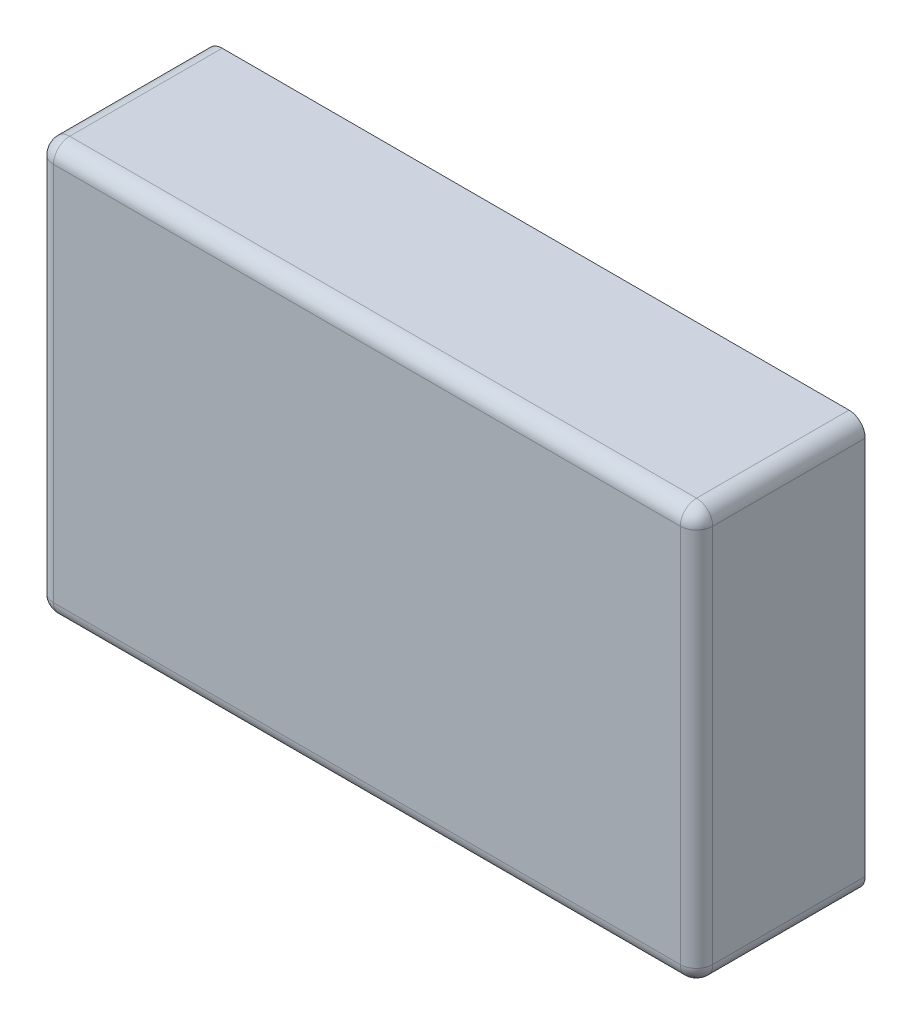
ISO-10303-21;
HEADER;
FILE_DESCRIPTION(('STEP AP214'),'2;1');
FILE_NAME('part.step','',(''),(''),'','','');
FILE_SCHEMA(('AUTOMOTIVE_DESIGN { 1 0 10303 214 1 1 1 1 }'));
ENDSEC;
DATA;
#1=APPLICATION_CONTEXT('core data for automotive mechanical design processes');
#2=APPLICATION_PROTOCOL_DEFINITION('international standard','automotive_design',2000,#1);
#3=PRODUCT_CONTEXT('',#1,'mechanical');
#4=PRODUCT('Part','Part','',(#3));
#5=PRODUCT_RELATED_PRODUCT_CATEGORY('part','',(#4));
#6=PRODUCT_DEFINITION_FORMATION('','',#4);
#7=PRODUCT_DEFINITION_CONTEXT('part definition',#1,'design');
#8=PRODUCT_DEFINITION('design','',#6,#7);
#9=PRODUCT_DEFINITION_SHAPE('','',#8);
#10=(LENGTH_UNIT() NAMED_UNIT(*) SI_UNIT(.MILLI.,.METRE.));
#11=(NAMED_UNIT(*) PLANE_ANGLE_UNIT() SI_UNIT($,.RADIAN.));
#12=(NAMED_UNIT(*) SI_UNIT($,.STERADIAN.) SOLID_ANGLE_UNIT());
#13=UNCERTAINTY_MEASURE_WITH_UNIT(LENGTH_MEASURE(1.E-05),#10,'distance_accuracy_value','');
#14=(GEOMETRIC_REPRESENTATION_CONTEXT(3) GLOBAL_UNCERTAINTY_ASSIGNED_CONTEXT((#13)) GLOBAL_UNIT_ASSIGNED_CONTEXT((#10,
#11,#12)) REPRESENTATION_CONTEXT('',''));
#15=CARTESIAN_POINT('',(0.,0.,0.));
#16=DIRECTION('',(0.,0.,1.));
#17=DIRECTION('',(1.,0.,0.));
#18=AXIS2_PLACEMENT_3D('',#15,#16,#17);
#19=CARTESIAN_POINT('',(16.631,26.15,10.9));
#20=CARTESIAN_POINT('',(16.631,26.15,10.9));
#21=CARTESIAN_POINT('',(16.631,26.15,10.9));
#22=CARTESIAN_POINT('',(16.631,26.15,10.9));
#23=CARTESIAN_POINT('',(16.631,26.15,11.4857864376269));
#24=CARTESIAN_POINT('',(16.631,26.4931457505076,11.4857864376269));
#25=CARTESIAN_POINT('',(16.631,26.7357864376269,11.2431457505076));
#26=CARTESIAN_POINT('',(16.631,26.7357864376269,10.9));
#27=CARTESIAN_POINT('',(17.0452135623731,26.15,11.9));
#28=CARTESIAN_POINT('',(17.0452135623731,26.7357864376269,11.9));
#29=CARTESIAN_POINT('',(17.0452135623731,27.15,11.4857864376269));
#30=CARTESIAN_POINT('',(17.0452135623731,27.15,10.9));
#31=CARTESIAN_POINT('',(17.631,26.15,11.9));
#32=CARTESIAN_POINT('',(17.631,26.7357864376269,11.9));
#33=CARTESIAN_POINT('',(17.631,27.15,11.4857864376269));
#34=CARTESIAN_POINT('',(17.631,27.15,10.9));
#35=(BOUNDED_SURFACE() B_SPLINE_SURFACE(3,3,((#19,#20,#21,#22),(#23,#24,#25,#26),(#27,#28,#29,
#30),(#31,#32,#33,#34)),.UNSPECIFIED.,.F.,.F.,.F.) B_SPLINE_SURFACE_WITH_KNOTS((4,4),(4,4),(0.,
1.),(0.,1.),.UNSPECIFIED.) GEOMETRIC_REPRESENTATION_ITEM() RATIONAL_B_SPLINE_SURFACE(((1.,
0.804737854124365,0.804737854124365,1.),(0.804737854124365,0.647603013860688,0.647603013860688,
0.804737854124365),(0.804737854124365,0.647603013860688,0.647603013860688,0.804737854124365),
(1.,0.804737854124365,0.804737854124365,1.))) REPRESENTATION_ITEM('') SURFACE());
#36=CARTESIAN_POINT('',(17.631,26.15,10.9));
#37=DIRECTION('',(1.,0.,0.));
#38=DIRECTION('',(0.,-1.,0.));
#39=AXIS2_PLACEMENT_3D('',#36,#37,#38);
#40=CIRCLE('',#39,1.);
#41=CARTESIAN_POINT('',(17.631,27.15,10.9));
#42=VERTEX_POINT('',#41);
#43=CARTESIAN_POINT('',(17.631,26.15,11.9));
#44=VERTEX_POINT('',#43);
#45=EDGE_CURVE('E206',#42,#44,#40,.T.);
#46=CARTESIAN_POINT('',(17.631,26.15,10.9));
#47=DIRECTION('',(0.,0.,-1.));
#48=DIRECTION('',(1.,0.,0.));
#49=AXIS2_PLACEMENT_3D('',#46,#47,#48);
#50=CIRCLE('',#49,1.);
#51=CARTESIAN_POINT('',(16.631,26.15,10.9));
#52=VERTEX_POINT('',#51);
#53=EDGE_CURVE('E204',#52,#42,#50,.T.);
#54=CARTESIAN_POINT('',(17.631,26.15,10.9));
#55=DIRECTION('',(0.,-1.,0.));
#56=DIRECTION('',(0.,0.,-1.));
#57=AXIS2_PLACEMENT_3D('',#54,#55,#56);
#58=CIRCLE('',#57,1.);
#59=EDGE_CURVE('E192',#44,#52,#58,.T.);
#60=ORIENTED_EDGE('',*,*,#45,.F.);
#61=ORIENTED_EDGE('',*,*,#53,.F.);
#62=ORIENTED_EDGE('',*,*,#59,.F.);
#63=EDGE_LOOP('',(#60,#61,#62));
#64=FACE_BOUND('',#63,.T.);
#65=ADVANCED_FACE('F18',(#64),#35,.T.);
#66=CARTESIAN_POINT('',(56.271,26.15,11.9));
#67=CARTESIAN_POINT('',(56.271,26.7357864376269,11.9));
#68=CARTESIAN_POINT('',(56.271,27.15,11.4857864376269));
#69=CARTESIAN_POINT('',(56.271,27.15,10.9));
#70=CARTESIAN_POINT('',(56.8567864376269,26.15,11.9));
#71=CARTESIAN_POINT('',(56.8567864376269,26.7357864376269,11.9));
#72=CARTESIAN_POINT('',(56.8567864376269,27.15,11.4857864376269));
#73=CARTESIAN_POINT('',(56.8567864376269,27.15,10.9));
#74=CARTESIAN_POINT('',(57.271,26.15,11.4857864376269));
#75=CARTESIAN_POINT('',(57.271,26.4931457505076,11.4857864376269));
#76=CARTESIAN_POINT('',(57.271,26.7357864376269,11.2431457505076));
#77=CARTESIAN_POINT('',(57.271,26.7357864376269,10.9));
#78=CARTESIAN_POINT('',(57.271,26.15,10.9));
#79=CARTESIAN_POINT('',(57.2710000000001,26.15,10.9));
#80=CARTESIAN_POINT('',(57.2710000000001,26.15,10.9));
#81=CARTESIAN_POINT('',(57.271,26.15,10.9));
#82=(BOUNDED_SURFACE() B_SPLINE_SURFACE(3,3,((#66,#67,#68,#69),(#70,#71,#72,#73),(#74,#75,#76,
#77),(#78,#79,#80,#81)),.UNSPECIFIED.,.F.,.F.,.F.) B_SPLINE_SURFACE_WITH_KNOTS((4,4),(4,4),(0.,
1.),(0.,1.),.UNSPECIFIED.) GEOMETRIC_REPRESENTATION_ITEM() RATIONAL_B_SPLINE_SURFACE(((1.,
0.804737854124364,0.804737854124364,1.),(0.804737854124365,0.647603013860688,0.647603013860688,
0.804737854124365),(0.804737854124365,0.647603013860688,0.647603013860688,0.804737854124365),
(1.,0.804737854124364,0.804737854124364,1.))) REPRESENTATION_ITEM('') SURFACE());
#83=CARTESIAN_POINT('',(56.271,26.15,10.9));
#84=DIRECTION('',(0.,0.,-1.));
#85=DIRECTION('',(1.,0.,0.));
#86=AXIS2_PLACEMENT_3D('',#83,#84,#85);
#87=CIRCLE('',#86,1.);
#88=CARTESIAN_POINT('',(56.271,27.15,10.9));
#89=VERTEX_POINT('',#88);
#90=CARTESIAN_POINT('',(57.271,26.15,10.9));
#91=VERTEX_POINT('',#90);
#92=EDGE_CURVE('E240',#89,#91,#87,.T.);
#93=CARTESIAN_POINT('',(56.271,26.15,10.9));
#94=DIRECTION('',(-1.,0.,0.));
#95=DIRECTION('',(0.,-1.,0.));
#96=AXIS2_PLACEMENT_3D('',#93,#94,#95);
#97=CIRCLE('',#96,1.);
#98=CARTESIAN_POINT('',(56.271,26.15,11.9));
#99=VERTEX_POINT('',#98);
#100=EDGE_CURVE('E201',#99,#89,#97,.T.);
#101=CARTESIAN_POINT('',(56.271,26.15,10.9));
#102=DIRECTION('',(0.,-1.,0.));
#103=DIRECTION('',(-1.,0.,0.));
#104=AXIS2_PLACEMENT_3D('',#101,#102,#103);
#105=CIRCLE('',#104,1.);
#106=EDGE_CURVE('E244',#91,#99,#105,.T.);
#107=ORIENTED_EDGE('',*,*,#92,.F.);
#108=ORIENTED_EDGE('',*,*,#100,.F.);
#109=ORIENTED_EDGE('',*,*,#106,.F.);
#110=EDGE_LOOP('',(#107,#108,#109));
#111=FACE_BOUND('',#110,.T.);
#112=ADVANCED_FACE('F408',(#111),#82,.T.);
#113=CARTESIAN_POINT('',(56.271,1.75,10.9));
#114=CARTESIAN_POINT('',(56.271,1.75000000000001,11.4857864376269));
#115=CARTESIAN_POINT('',(56.271,2.16421356237311,11.9));
#116=CARTESIAN_POINT('',(56.271,2.75,11.9));
#117=CARTESIAN_POINT('',(56.8567864376269,1.75000000000001,10.9));
#118=CARTESIAN_POINT('',(56.8567864376269,1.75000000000001,11.4857864376269));
#119=CARTESIAN_POINT('',(56.8567864376269,2.16421356237311,11.9));
#120=CARTESIAN_POINT('',(56.8567864376269,2.75000000000001,11.9));
#121=CARTESIAN_POINT('',(57.271,2.16421356237311,10.9));
#122=CARTESIAN_POINT('',(57.271,2.1642135623731,11.2431457505076));
#123=CARTESIAN_POINT('',(57.271,2.40685424949239,11.4857864376269));
#124=CARTESIAN_POINT('',(57.271,2.75000000000001,11.4857864376269));
#125=CARTESIAN_POINT('',(57.271,2.75,10.9));
#126=CARTESIAN_POINT('',(57.271,2.75000000000001,10.9));
#127=CARTESIAN_POINT('',(57.271,2.75000000000001,10.9));
#128=CARTESIAN_POINT('',(57.271,2.75,10.9));
#129=(BOUNDED_SURFACE() B_SPLINE_SURFACE(3,3,((#113,#114,#115,#116),(#117,#118,#119,#120),(#121,
#122,#123,#124),(#125,#126,#127,#128)),.UNSPECIFIED.,.F.,.F.,
.F.) B_SPLINE_SURFACE_WITH_KNOTS((4,4),(4,4),(0.,1.),(0.,1.),
.UNSPECIFIED.) GEOMETRIC_REPRESENTATION_ITEM() RATIONAL_B_SPLINE_SURFACE(((1.,0.804737854124365,
0.804737854124365,1.),(0.804737854124365,0.647603013860688,0.647603013860688,0.804737854124365),
(0.804737854124365,0.647603013860688,0.647603013860688,0.804737854124365),(1.,0.804737854124365,
0.804737854124365,1.))) REPRESENTATION_ITEM('') SURFACE());
#130=CARTESIAN_POINT('',(56.271,2.75,10.9));
#131=DIRECTION('',(0.,0.,-1.));
#132=DIRECTION('',(1.,0.,0.));
#133=AXIS2_PLACEMENT_3D('',#130,#131,#132);
#134=CIRCLE('',#133,1.);
#135=CARTESIAN_POINT('',(57.271,2.75,10.9));
#136=VERTEX_POINT('',#135);
#137=CARTESIAN_POINT('',(56.271,1.75,10.9));
#138=VERTEX_POINT('',#137);
#139=EDGE_CURVE('E245',#136,#138,#134,.T.);
#140=CARTESIAN_POINT('',(56.271,2.75,10.9));
#141=DIRECTION('',(0.,1.,0.));
#142=DIRECTION('',(-1.,0.,0.));
#143=AXIS2_PLACEMENT_3D('',#140,#141,#142);
#144=CIRCLE('',#143,1.);
#145=CARTESIAN_POINT('',(56.271,2.75,11.9));
#146=VERTEX_POINT('',#145);
#147=EDGE_CURVE('E211',#146,#136,#144,.T.);
#148=CARTESIAN_POINT('',(56.271,2.75,10.9));
#149=DIRECTION('',(-1.,0.,0.));
#150=DIRECTION('',(0.,0.,1.));
#151=AXIS2_PLACEMENT_3D('',#148,#149,#150);
#152=CIRCLE('',#151,1.);
#153=EDGE_CURVE('E322',#138,#146,#152,.T.);
#154=ORIENTED_EDGE('',*,*,#139,.F.);
#155=ORIENTED_EDGE('',*,*,#147,.F.);
#156=ORIENTED_EDGE('',*,*,#153,.F.);
#157=EDGE_LOOP('',(#154,#155,#156));
#158=FACE_BOUND('',#157,.T.);
#159=ADVANCED_FACE('F414',(#158),#129,.T.);
#160=CARTESIAN_POINT('',(57.271,1.75,11.9));
#161=DIRECTION('',(0.,0.,-1.));
#162=DIRECTION('',(-1.,0.,0.));
#163=AXIS2_PLACEMENT_3D('',#160,#161,#162);
#164=PLANE('',#163);
#165=DIRECTION('',(0.,1.,0.));
#166=VECTOR('',#165,1.);
#167=CARTESIAN_POINT('',(17.631,1.75,11.9));
#168=LINE('',#167,#166);
#169=CARTESIAN_POINT('',(17.631,2.75,11.9));
#170=VERTEX_POINT('',#169);
#171=EDGE_CURVE('E11',#170,#44,#168,.T.);
#172=ORIENTED_EDGE('',*,*,#171,.F.);
#173=DIRECTION('',(-1.,0.,0.));
#174=VECTOR('',#173,1.);
#175=CARTESIAN_POINT('',(57.271,2.75,11.9));
#176=LINE('',#175,#174);
#177=EDGE_CURVE('E317',#146,#170,#176,.T.);
#178=ORIENTED_EDGE('',*,*,#177,.F.);
#179=DIRECTION('',(0.,-1.,0.));
#180=VECTOR('',#179,1.);
#181=CARTESIAN_POINT('',(56.271,27.15,11.9));
#182=LINE('',#181,#180);
#183=EDGE_CURVE('E270',#99,#146,#182,.T.);
#184=ORIENTED_EDGE('',*,*,#183,.F.);
#185=DIRECTION('',(1.,0.,0.));
#186=VECTOR('',#185,1.);
#187=CARTESIAN_POINT('',(16.631,26.15,11.9));
#188=LINE('',#187,#186);
#189=EDGE_CURVE('E273',#44,#99,#188,.T.);
#190=ORIENTED_EDGE('',*,*,#189,.F.);
#191=EDGE_LOOP('',(#172,#178,#184,#190));
#192=FACE_BOUND('',#191,.T.);
#193=ADVANCED_FACE('F453',(#192),#164,.F.);
#194=CARTESIAN_POINT('',(16.631,2.75,10.9));
#195=CARTESIAN_POINT('',(16.631,2.75000000000001,10.9));
#196=CARTESIAN_POINT('',(16.631,2.75000000000001,10.9));
#197=CARTESIAN_POINT('',(16.631,2.75,10.9));
#198=CARTESIAN_POINT('',(16.631,2.1642135623731,10.9));
#199=CARTESIAN_POINT('',(16.631,2.1642135623731,11.2431457505076));
#200=CARTESIAN_POINT('',(16.631,2.40685424949239,11.4857864376269));
#201=CARTESIAN_POINT('',(16.631,2.75000000000001,11.4857864376269));
#202=CARTESIAN_POINT('',(17.0452135623731,1.75000000000001,10.9));
#203=CARTESIAN_POINT('',(17.0452135623731,1.75000000000001,11.4857864376269));
#204=CARTESIAN_POINT('',(17.0452135623731,2.1642135623731,11.9));
#205=CARTESIAN_POINT('',(17.0452135623731,2.75000000000001,11.9));
#206=CARTESIAN_POINT('',(17.631,1.75,10.9));
#207=CARTESIAN_POINT('',(17.631,1.75000000000001,11.4857864376269));
#208=CARTESIAN_POINT('',(17.631,2.1642135623731,11.9));
#209=CARTESIAN_POINT('',(17.631,2.75,11.9));
#210=(BOUNDED_SURFACE() B_SPLINE_SURFACE(3,3,((#194,#195,#196,#197),(#198,#199,#200,#201),(#202,
#203,#204,#205),(#206,#207,#208,#209)),.UNSPECIFIED.,.F.,.F.,
.F.) B_SPLINE_SURFACE_WITH_KNOTS((4,4),(4,4),(0.,1.),(0.,1.),
.UNSPECIFIED.) GEOMETRIC_REPRESENTATION_ITEM() RATIONAL_B_SPLINE_SURFACE(((1.,0.804737854124365,
0.804737854124365,1.),(0.804737854124365,0.647603013860688,0.647603013860688,0.804737854124365),
(0.804737854124365,0.647603013860688,0.647603013860688,0.804737854124365),(1.,0.804737854124365,
0.804737854124365,1.))) REPRESENTATION_ITEM('') SURFACE());
#211=CARTESIAN_POINT('',(17.631,2.75,10.9));
#212=DIRECTION('',(1.,0.,0.));
#213=DIRECTION('',(0.,0.,1.));
#214=AXIS2_PLACEMENT_3D('',#211,#212,#213);
#215=CIRCLE('',#214,1.);
#216=CARTESIAN_POINT('',(17.631,1.75,10.9));
#217=VERTEX_POINT('',#216);
#218=EDGE_CURVE('E220',#170,#217,#215,.T.);
#219=CARTESIAN_POINT('',(17.631,2.75,10.9));
#220=DIRECTION('',(0.,1.,0.));
#221=DIRECTION('',(0.,0.,-1.));
#222=AXIS2_PLACEMENT_3D('',#219,#220,#221);
#223=CIRCLE('',#222,1.);
#224=CARTESIAN_POINT('',(16.631,2.75,10.9));
#225=VERTEX_POINT('',#224);
#226=EDGE_CURVE('E29',#225,#170,#223,.T.);
#227=CARTESIAN_POINT('',(17.631,2.75,10.9));
#228=DIRECTION('',(0.,0.,-1.));
#229=DIRECTION('',(1.,0.,0.));
#230=AXIS2_PLACEMENT_3D('',#227,#228,#229);
#231=CIRCLE('',#230,1.);
#232=EDGE_CURVE('E321',#217,#225,#231,.T.);
#233=ORIENTED_EDGE('',*,*,#218,.F.);
#234=ORIENTED_EDGE('',*,*,#226,.F.);
#235=ORIENTED_EDGE('',*,*,#232,.F.);
#236=EDGE_LOOP('',(#233,#234,#235));
#237=FACE_BOUND('',#236,.T.);
#238=ADVANCED_FACE('F448',(#237),#210,.T.);
#239=CARTESIAN_POINT('',(26.791,24.61,-0.500000000000007));
#240=DIRECTION('',(0.,0.,1.));
#241=DIRECTION('',(0.,-1.,0.));
#242=AXIS2_PLACEMENT_3D('',#239,#240,#241);
#243=PLANE('',#242);
#244=CARTESIAN_POINT('',(26.791,24.61,-0.500000000000007));
#245=DIRECTION('',(0.,0.,1.));
#246=DIRECTION('',(1.,0.,0.));
#247=AXIS2_PLACEMENT_3D('',#244,#245,#246);
#248=CIRCLE('',#247,0.5);
#249=CARTESIAN_POINT('',(26.291,24.61,-0.500000000000007));
#250=VERTEX_POINT('',#249);
#251=EDGE_CURVE('E295',#250,#250,#248,.T.);
#252=ORIENTED_EDGE('',*,*,#251,.F.);
#253=EDGE_LOOP('',(#252));
#254=FACE_BOUND('',#253,.T.);
#255=ADVANCED_FACE('F402',(#254),#243,.F.);
#256=CARTESIAN_POINT('',(26.791,16.99,-0.500000000000007));
#257=DIRECTION('',(0.,0.,1.));
#258=DIRECTION('',(0.,-1.,0.));
#259=AXIS2_PLACEMENT_3D('',#256,#257,#258);
#260=PLANE('',#259);
#261=CARTESIAN_POINT('',(26.791,16.99,-0.500000000000007));
#262=DIRECTION('',(0.,0.,1.));
#263=DIRECTION('',(1.,0.,0.));
#264=AXIS2_PLACEMENT_3D('',#261,#262,#263);
#265=CIRCLE('',#264,0.5);
#266=CARTESIAN_POINT('',(26.291,16.99,-0.500000000000007));
#267=VERTEX_POINT('',#266);
#268=EDGE_CURVE('E296',#267,#267,#265,.T.);
#269=ORIENTED_EDGE('',*,*,#268,.F.);
#270=EDGE_LOOP('',(#269));
#271=FACE_BOUND('',#270,.T.);
#272=ADVANCED_FACE('F392',(#271),#260,.F.);
#273=CARTESIAN_POINT('',(26.791,11.91,-0.500000000000007));
#274=DIRECTION('',(0.,0.,1.));
#275=DIRECTION('',(0.,-1.,0.));
#276=AXIS2_PLACEMENT_3D('',#273,#274,#275);
#277=PLANE('',#276);
#278=CARTESIAN_POINT('',(26.791,11.91,-0.500000000000007));
#279=DIRECTION('',(0.,0.,1.));
#280=DIRECTION('',(1.,0.,0.));
#281=AXIS2_PLACEMENT_3D('',#278,#279,#280);
#282=CIRCLE('',#281,0.5);
#283=CARTESIAN_POINT('',(26.291,11.91,-0.500000000000007));
#284=VERTEX_POINT('',#283);
#285=EDGE_CURVE('E259',#284,#284,#282,.T.);
#286=ORIENTED_EDGE('',*,*,#285,.F.);
#287=EDGE_LOOP('',(#286));
#288=FACE_BOUND('',#287,.T.);
#289=ADVANCED_FACE('F389',(#288),#277,.F.);
#290=CARTESIAN_POINT('',(47.111,24.61,-0.5));
#291=DIRECTION('',(0.,0.,1.));
#292=DIRECTION('',(0.,-1.,0.));
#293=AXIS2_PLACEMENT_3D('',#290,#291,#292);
#294=PLANE('',#293);
#295=CARTESIAN_POINT('',(47.111,24.61,-0.5));
#296=DIRECTION('',(0.,0.,1.));
#297=DIRECTION('',(1.,0.,0.));
#298=AXIS2_PLACEMENT_3D('',#295,#296,#297);
#299=CIRCLE('',#298,0.5);
#300=CARTESIAN_POINT('',(46.611,24.61,-0.5));
#301=VERTEX_POINT('',#300);
#302=EDGE_CURVE('E341',#301,#301,#299,.T.);
#303=ORIENTED_EDGE('',*,*,#302,.F.);
#304=EDGE_LOOP('',(#303));
#305=FACE_BOUND('',#304,.T.);
#306=ADVANCED_FACE('F391',(#305),#294,.F.);
#307=CARTESIAN_POINT('',(47.111,14.45,-0.5));
#308=DIRECTION('',(0.,0.,1.));
#309=DIRECTION('',(0.,-1.,0.));
#310=AXIS2_PLACEMENT_3D('',#307,#308,#309);
#311=PLANE('',#310);
#312=CARTESIAN_POINT('',(47.111,14.45,-0.5));
#313=DIRECTION('',(0.,0.,1.));
#314=DIRECTION('',(1.,0.,0.));
#315=AXIS2_PLACEMENT_3D('',#312,#313,#314);
#316=CIRCLE('',#315,0.5);
#317=CARTESIAN_POINT('',(46.611,14.45,-0.5));
#318=VERTEX_POINT('',#317);
#319=EDGE_CURVE('E144',#318,#318,#316,.T.);
#320=ORIENTED_EDGE('',*,*,#319,.F.);
#321=EDGE_LOOP('',(#320));
#322=FACE_BOUND('',#321,.T.);
#323=ADVANCED_FACE('F399',(#322),#311,.F.);
#324=CARTESIAN_POINT('',(47.111,4.29,-0.5));
#325=DIRECTION('',(0.,0.,1.));
#326=DIRECTION('',(0.,-1.,0.));
#327=AXIS2_PLACEMENT_3D('',#324,#325,#326);
#328=PLANE('',#327);
#329=CARTESIAN_POINT('',(47.111,4.29,-0.5));
#330=DIRECTION('',(0.,0.,1.));
#331=DIRECTION('',(1.,0.,0.));
#332=AXIS2_PLACEMENT_3D('',#329,#330,#331);
#333=CIRCLE('',#332,0.5);
#334=CARTESIAN_POINT('',(46.611,4.29,-0.5));
#335=VERTEX_POINT('',#334);
#336=EDGE_CURVE('E303',#335,#335,#333,.T.);
#337=ORIENTED_EDGE('',*,*,#336,.F.);
#338=EDGE_LOOP('',(#337));
#339=FACE_BOUND('',#338,.T.);
#340=ADVANCED_FACE('F522',(#339),#328,.F.);
#341=CARTESIAN_POINT('',(17.631,1.75,10.9));
#342=DIRECTION('',(0.,1.,0.));
#343=DIRECTION('',(0.,0.,-1.));
#344=AXIS2_PLACEMENT_3D('',#341,#342,#343);
#345=CYLINDRICAL_SURFACE('',#344,1.);
#346=ORIENTED_EDGE('',*,*,#59,.T.);
#347=DIRECTION('',(0.,-1.,0.));
#348=VECTOR('',#347,1.);
#349=CARTESIAN_POINT('',(16.631,1.75,10.9));
#350=LINE('',#349,#348);
#351=EDGE_CURVE('E196',#52,#225,#350,.T.);
#352=ORIENTED_EDGE('',*,*,#351,.T.);
#353=ORIENTED_EDGE('',*,*,#226,.T.);
#354=ORIENTED_EDGE('',*,*,#171,.T.);
#355=EDGE_LOOP('',(#346,#352,#353,#354));
#356=FACE_BOUND('',#355,.T.);
#357=ADVANCED_FACE('F194',(#356),#345,.T.);
#358=CARTESIAN_POINT('',(16.631,26.15,10.9));
#359=DIRECTION('',(1.,0.,0.));
#360=DIRECTION('',(0.,-1.,0.));
#361=AXIS2_PLACEMENT_3D('',#358,#359,#360);
#362=CYLINDRICAL_SURFACE('',#361,1.);
#363=ORIENTED_EDGE('',*,*,#45,.T.);
#364=ORIENTED_EDGE('',*,*,#189,.T.);
#365=ORIENTED_EDGE('',*,*,#100,.T.);
#366=DIRECTION('',(-1.,0.,0.));
#367=VECTOR('',#366,1.);
#368=CARTESIAN_POINT('',(16.631,27.15,10.9));
#369=LINE('',#368,#367);
#370=EDGE_CURVE('E234',#89,#42,#369,.T.);
#371=ORIENTED_EDGE('',*,*,#370,.T.);
#372=EDGE_LOOP('',(#363,#364,#365,#371));
#373=FACE_BOUND('',#372,.T.);
#374=ADVANCED_FACE('F521',(#373),#362,.T.);
#375=CARTESIAN_POINT('',(17.631,26.15,1.5));
#376=DIRECTION('',(0.,0.,1.));
#377=DIRECTION('',(1.,0.,0.));
#378=AXIS2_PLACEMENT_3D('',#375,#376,#377);
#379=CYLINDRICAL_SURFACE('',#378,1.);
#380=ORIENTED_EDGE('',*,*,#53,.T.);
#381=DIRECTION('',(0.,0.,-1.));
#382=VECTOR('',#381,1.);
#383=CARTESIAN_POINT('',(17.631,27.15,1.5));
#384=LINE('',#383,#382);
#385=CARTESIAN_POINT('',(17.631,27.15,1.5));
#386=VERTEX_POINT('',#385);
#387=EDGE_CURVE('E336',#42,#386,#384,.T.);
#388=ORIENTED_EDGE('',*,*,#387,.T.);
#389=CARTESIAN_POINT('',(17.631,26.15,1.5));
#390=DIRECTION('',(0.,0.,1.));
#391=DIRECTION('',(1.,0.,0.));
#392=AXIS2_PLACEMENT_3D('',#389,#390,#391);
#393=CIRCLE('',#392,1.);
#394=CARTESIAN_POINT('',(16.631,26.15,1.5));
#395=VERTEX_POINT('',#394);
#396=EDGE_CURVE('E223',#386,#395,#393,.T.);
#397=ORIENTED_EDGE('',*,*,#396,.T.);
#398=DIRECTION('',(0.,0.,1.));
#399=VECTOR('',#398,1.);
#400=CARTESIAN_POINT('',(16.631,26.15,1.5));
#401=LINE('',#400,#399);
#402=EDGE_CURVE('E216',#395,#52,#401,.T.);
#403=ORIENTED_EDGE('',*,*,#402,.T.);
#404=EDGE_LOOP('',(#380,#388,#397,#403));
#405=FACE_BOUND('',#404,.T.);
#406=ADVANCED_FACE('F221',(#405),#379,.T.);
#407=CARTESIAN_POINT('',(56.271,27.15,10.9));
#408=DIRECTION('',(0.,-1.,0.));
#409=DIRECTION('',(-1.,0.,0.));
#410=AXIS2_PLACEMENT_3D('',#407,#408,#409);
#411=CYLINDRICAL_SURFACE('',#410,1.);
#412=ORIENTED_EDGE('',*,*,#106,.T.);
#413=ORIENTED_EDGE('',*,*,#183,.T.);
#414=ORIENTED_EDGE('',*,*,#147,.T.);
#415=DIRECTION('',(0.,1.,0.));
#416=VECTOR('',#415,1.);
#417=CARTESIAN_POINT('',(57.271,27.15,10.9));
#418=LINE('',#417,#416);
#419=EDGE_CURVE('E309',#136,#91,#418,.T.);
#420=ORIENTED_EDGE('',*,*,#419,.T.);
#421=EDGE_LOOP('',(#412,#413,#414,#420));
#422=FACE_BOUND('',#421,.T.);
#423=ADVANCED_FACE('F561',(#422),#411,.T.);
#424=CARTESIAN_POINT('',(56.271,26.15,1.5));
#425=DIRECTION('',(0.,0.,1.));
#426=DIRECTION('',(1.,0.,0.));
#427=AXIS2_PLACEMENT_3D('',#424,#425,#426);
#428=CYLINDRICAL_SURFACE('',#427,1.);
#429=ORIENTED_EDGE('',*,*,#92,.T.);
#430=DIRECTION('',(0.,0.,-1.));
#431=VECTOR('',#430,1.);
#432=CARTESIAN_POINT('',(57.271,26.15,1.5));
#433=LINE('',#432,#431);
#434=CARTESIAN_POINT('',(57.271,26.15,1.5));
#435=VERTEX_POINT('',#434);
#436=EDGE_CURVE('E277',#91,#435,#433,.T.);
#437=ORIENTED_EDGE('',*,*,#436,.T.);
#438=CARTESIAN_POINT('',(56.271,26.15,1.5));
#439=DIRECTION('',(0.,0.,1.));
#440=DIRECTION('',(1.,0.,0.));
#441=AXIS2_PLACEMENT_3D('',#438,#439,#440);
#442=CIRCLE('',#441,1.);
#443=CARTESIAN_POINT('',(56.271,27.15,1.5));
#444=VERTEX_POINT('',#443);
#445=EDGE_CURVE('E255',#435,#444,#442,.T.);
#446=ORIENTED_EDGE('',*,*,#445,.T.);
#447=DIRECTION('',(0.,0.,1.));
#448=VECTOR('',#447,1.);
#449=CARTESIAN_POINT('',(56.271,27.15,1.5));
#450=LINE('',#449,#448);
#451=EDGE_CURVE('E226',#444,#89,#450,.T.);
#452=ORIENTED_EDGE('',*,*,#451,.T.);
#453=EDGE_LOOP('',(#429,#437,#446,#452));
#454=FACE_BOUND('',#453,.T.);
#455=ADVANCED_FACE('F563',(#454),#428,.T.);
#456=CARTESIAN_POINT('',(56.271,2.75,1.5));
#457=DIRECTION('',(0.,0.,1.));
#458=DIRECTION('',(1.,0.,0.));
#459=AXIS2_PLACEMENT_3D('',#456,#457,#458);
#460=CYLINDRICAL_SURFACE('',#459,1.);
#461=CARTESIAN_POINT('',(56.271,2.75,1.5));
#462=DIRECTION('',(0.,0.,1.));
#463=DIRECTION('',(1.,0.,0.));
#464=AXIS2_PLACEMENT_3D('',#461,#462,#463);
#465=CIRCLE('',#464,1.);
#466=CARTESIAN_POINT('',(56.271,1.75,1.5));
#467=VERTEX_POINT('',#466);
#468=CARTESIAN_POINT('',(57.271,2.75,1.5));
#469=VERTEX_POINT('',#468);
#470=EDGE_CURVE('E254',#467,#469,#465,.T.);
#471=ORIENTED_EDGE('',*,*,#470,.T.);
#472=DIRECTION('',(0.,0.,1.));
#473=VECTOR('',#472,1.);
#474=CARTESIAN_POINT('',(57.271,2.75,1.5));
#475=LINE('',#474,#473);
#476=EDGE_CURVE('E313',#469,#136,#475,.T.);
#477=ORIENTED_EDGE('',*,*,#476,.T.);
#478=ORIENTED_EDGE('',*,*,#139,.T.);
#479=DIRECTION('',(0.,0.,-1.));
#480=VECTOR('',#479,1.);
#481=CARTESIAN_POINT('',(56.271,1.75,1.5));
#482=LINE('',#481,#480);
#483=EDGE_CURVE('E278',#138,#467,#482,.T.);
#484=ORIENTED_EDGE('',*,*,#483,.T.);
#485=EDGE_LOOP('',(#471,#477,#478,#484));
#486=FACE_BOUND('',#485,.T.);
#487=ADVANCED_FACE('F421',(#486),#460,.T.);
#488=CARTESIAN_POINT('',(17.631,2.75,1.5));
#489=DIRECTION('',(0.,0.,1.));
#490=DIRECTION('',(1.,0.,0.));
#491=AXIS2_PLACEMENT_3D('',#488,#489,#490);
#492=CYLINDRICAL_SURFACE('',#491,1.);
#493=ORIENTED_EDGE('',*,*,#232,.T.);
#494=DIRECTION('',(0.,0.,-1.));
#495=VECTOR('',#494,1.);
#496=CARTESIAN_POINT('',(16.631,2.75,1.5));
#497=LINE('',#496,#495);
#498=CARTESIAN_POINT('',(16.631,2.75,1.5));
#499=VERTEX_POINT('',#498);
#500=EDGE_CURVE('E218',#225,#499,#497,.T.);
#501=ORIENTED_EDGE('',*,*,#500,.T.);
#502=CARTESIAN_POINT('',(17.631,2.75,1.5));
#503=DIRECTION('',(0.,0.,1.));
#504=DIRECTION('',(1.,0.,0.));
#505=AXIS2_PLACEMENT_3D('',#502,#503,#504);
#506=CIRCLE('',#505,1.);
#507=CARTESIAN_POINT('',(17.631,1.75,1.5));
#508=VERTEX_POINT('',#507);
#509=EDGE_CURVE('E297',#499,#508,#506,.T.);
#510=ORIENTED_EDGE('',*,*,#509,.T.);
#511=DIRECTION('',(0.,0.,1.));
#512=VECTOR('',#511,1.);
#513=CARTESIAN_POINT('',(17.631,1.75,1.5));
#514=LINE('',#513,#512);
#515=EDGE_CURVE('E353',#508,#217,#514,.T.);
#516=ORIENTED_EDGE('',*,*,#515,.T.);
#517=EDGE_LOOP('',(#493,#501,#510,#516));
#518=FACE_BOUND('',#517,.T.);
#519=ADVANCED_FACE('F837',(#518),#492,.T.);
#520=CARTESIAN_POINT('',(57.271,2.75,10.9));
#521=DIRECTION('',(-1.,0.,0.));
#522=DIRECTION('',(0.,0.,1.));
#523=AXIS2_PLACEMENT_3D('',#520,#521,#522);
#524=CYLINDRICAL_SURFACE('',#523,1.);
#525=ORIENTED_EDGE('',*,*,#218,.T.);
#526=DIRECTION('',(1.,0.,0.));
#527=VECTOR('',#526,1.);
#528=CARTESIAN_POINT('',(57.271,1.75,10.9));
#529=LINE('',#528,#527);
#530=EDGE_CURVE('E274',#217,#138,#529,.T.);
#531=ORIENTED_EDGE('',*,*,#530,.T.);
#532=ORIENTED_EDGE('',*,*,#153,.T.);
#533=ORIENTED_EDGE('',*,*,#177,.T.);
#534=EDGE_LOOP('',(#525,#531,#532,#533));
#535=FACE_BOUND('',#534,.T.);
#536=ADVANCED_FACE('F20',(#535),#524,.T.);
#537=CARTESIAN_POINT('',(23.481,24.61,1.5));
#538=CARTESIAN_POINT('',(23.481,24.61,1.5));
#539=CARTESIAN_POINT('',(23.481,24.61,1.5));
#540=CARTESIAN_POINT('',(23.481,24.61,1.5));
#541=CARTESIAN_POINT('',(23.481,23.61,1.5));
#542=CARTESIAN_POINT('',(23.481,23.61,-0.500000000000009));
#543=CARTESIAN_POINT('',(23.481,25.61,-0.500000000000009));
#544=CARTESIAN_POINT('',(23.481,25.61,1.5));
#545=CARTESIAN_POINT('',(22.481,23.61,1.5));
#546=CARTESIAN_POINT('',(22.481,23.61,-0.500000000000009));
#547=CARTESIAN_POINT('',(22.481,25.61,-0.500000000000009));
#548=CARTESIAN_POINT('',(22.481,25.61,1.5));
#549=CARTESIAN_POINT('',(22.481,24.61,1.5));
#550=CARTESIAN_POINT('',(22.481,24.61,1.5));
#551=CARTESIAN_POINT('',(22.481,24.61,1.5));
#552=CARTESIAN_POINT('',(22.481,24.61,1.5));
#553=(BOUNDED_SURFACE() B_SPLINE_SURFACE(3,3,((#537,#538,#539,#540),(#541,#542,#543,#544),(#545,
#546,#547,#548),(#549,#550,#551,#552)),.UNSPECIFIED.,.F.,.F.,
.F.) B_SPLINE_SURFACE_WITH_KNOTS((4,4),(4,4),(0.,1.),(0.,1.),
.UNSPECIFIED.) GEOMETRIC_REPRESENTATION_ITEM() RATIONAL_B_SPLINE_SURFACE(((1.,0.333333333333334,
0.333333333333334,1.),(0.333333333333334,0.111111111111111,0.111111111111111,0.333333333333334),
(0.333333333333334,0.111111111111111,0.111111111111111,0.333333333333334),(1.,0.333333333333334,
0.333333333333334,1.))) REPRESENTATION_ITEM('') SURFACE());
#554=CARTESIAN_POINT('',(22.981,24.61,1.5));
#555=DIRECTION('',(0.,0.,1.));
#556=DIRECTION('',(1.,0.,0.));
#557=AXIS2_PLACEMENT_3D('',#554,#555,#556);
#558=CIRCLE('',#557,0.5);
#559=CARTESIAN_POINT('',(23.481,24.61,1.5));
#560=VERTEX_POINT('',#559);
#561=CARTESIAN_POINT('',(22.481,24.61,1.5));
#562=VERTEX_POINT('',#561);
#563=EDGE_CURVE('E286',#560,#562,#558,.T.);
#564=CARTESIAN_POINT('',(22.981,24.61,1.5));
#565=DIRECTION('',(0.,0.,1.));
#566=DIRECTION('',(1.,0.,0.));
#567=AXIS2_PLACEMENT_3D('',#564,#565,#566);
#568=CIRCLE('',#567,0.5);
#569=EDGE_CURVE('E350',#562,#560,#568,.T.);
#570=ORIENTED_EDGE('',*,*,#563,.F.);
#571=ORIENTED_EDGE('',*,*,#569,.F.);
#572=EDGE_LOOP('',(#570,#571));
#573=FACE_BOUND('',#572,.T.);
#574=ADVANCED_FACE('F479',(#573),#553,.T.);
#575=CARTESIAN_POINT('',(23.481,4.29,1.5));
#576=CARTESIAN_POINT('',(23.481,4.29,1.5));
#577=CARTESIAN_POINT('',(23.481,4.29,1.5));
#578=CARTESIAN_POINT('',(23.481,4.29,1.5));
#579=CARTESIAN_POINT('',(23.481,3.29000000000001,1.5));
#580=CARTESIAN_POINT('',(23.4809999999999,3.29000000000001,-0.500000000000002));
#581=CARTESIAN_POINT('',(23.4809999999999,5.29000000000001,-0.500000000000002));
#582=CARTESIAN_POINT('',(23.481,5.29000000000001,1.5));
#583=CARTESIAN_POINT('',(22.481,3.29000000000001,1.5));
#584=CARTESIAN_POINT('',(22.481,3.29000000000001,-0.500000000000002));
#585=CARTESIAN_POINT('',(22.481,5.29000000000001,-0.500000000000002));
#586=CARTESIAN_POINT('',(22.481,5.29000000000001,1.5));
#587=CARTESIAN_POINT('',(22.481,4.29,1.5));
#588=CARTESIAN_POINT('',(22.481,4.29,1.5));
#589=CARTESIAN_POINT('',(22.481,4.29,1.5));
#590=CARTESIAN_POINT('',(22.481,4.29,1.5));
#591=(BOUNDED_SURFACE() B_SPLINE_SURFACE(3,3,((#575,#576,#577,#578),(#579,#580,#581,#582),(#583,
#584,#585,#586),(#587,#588,#589,#590)),.UNSPECIFIED.,.F.,.F.,
.F.) B_SPLINE_SURFACE_WITH_KNOTS((4,4),(4,4),(0.,1.),(0.,1.),
.UNSPECIFIED.) GEOMETRIC_REPRESENTATION_ITEM() RATIONAL_B_SPLINE_SURFACE(((1.,0.333333333333334,
0.333333333333334,1.),(0.333333333333334,0.111111111111111,0.111111111111111,0.333333333333334),
(0.333333333333334,0.111111111111111,0.111111111111111,0.333333333333334),(1.,0.333333333333334,
0.333333333333334,1.))) REPRESENTATION_ITEM('') SURFACE());
#592=CARTESIAN_POINT('',(22.981,4.29,1.5));
#593=DIRECTION('',(0.,0.,1.));
#594=DIRECTION('',(1.,0.,0.));
#595=AXIS2_PLACEMENT_3D('',#592,#593,#594);
#596=CIRCLE('',#595,0.5);
#597=CARTESIAN_POINT('',(23.481,4.29,1.5));
#598=VERTEX_POINT('',#597);
#599=CARTESIAN_POINT('',(22.481,4.29,1.5));
#600=VERTEX_POINT('',#599);
#601=EDGE_CURVE('E287',#598,#600,#596,.T.);
#602=CARTESIAN_POINT('',(22.981,4.29,1.5));
#603=DIRECTION('',(0.,0.,1.));
#604=DIRECTION('',(1.,0.,0.));
#605=AXIS2_PLACEMENT_3D('',#602,#603,#604);
#606=CIRCLE('',#605,0.5);
#607=EDGE_CURVE('E283',#600,#598,#606,.T.);
#608=ORIENTED_EDGE('',*,*,#601,.F.);
#609=ORIENTED_EDGE('',*,*,#607,.F.);
#610=EDGE_LOOP('',(#608,#609));
#611=FACE_BOUND('',#610,.T.);
#612=ADVANCED_FACE('F470',(#611),#591,.T.);
#613=CARTESIAN_POINT('',(51.421,4.29,1.5));
#614=CARTESIAN_POINT('',(51.421,4.29,1.5));
#615=CARTESIAN_POINT('',(51.421,4.29,1.5));
#616=CARTESIAN_POINT('',(51.421,4.29,1.5));
#617=CARTESIAN_POINT('',(51.4209999999999,3.29,1.5));
#618=CARTESIAN_POINT('',(51.421,3.29,-0.499999999999998));
#619=CARTESIAN_POINT('',(51.421,5.29,-0.499999999999998));
#620=CARTESIAN_POINT('',(51.4209999999999,5.28999999999999,1.5));
#621=CARTESIAN_POINT('',(50.4209999999999,3.29,1.5));
#622=CARTESIAN_POINT('',(50.421,3.29,-0.499999999999998));
#623=CARTESIAN_POINT('',(50.421,5.29,-0.499999999999998));
#624=CARTESIAN_POINT('',(50.4209999999999,5.28999999999999,1.5));
#625=CARTESIAN_POINT('',(50.421,4.29,1.5));
#626=CARTESIAN_POINT('',(50.421,4.29,1.5));
#627=CARTESIAN_POINT('',(50.421,4.29,1.5));
#628=CARTESIAN_POINT('',(50.421,4.29,1.5));
#629=(BOUNDED_SURFACE() B_SPLINE_SURFACE(3,3,((#613,#614,#615,#616),(#617,#618,#619,#620),(#621,
#622,#623,#624),(#625,#626,#627,#628)),.UNSPECIFIED.,.F.,.F.,
.F.) B_SPLINE_SURFACE_WITH_KNOTS((4,4),(4,4),(0.,1.),(0.,1.),
.UNSPECIFIED.) GEOMETRIC_REPRESENTATION_ITEM() RATIONAL_B_SPLINE_SURFACE(((1.,0.333333333333334,
0.333333333333334,1.),(0.333333333333334,0.111111111111111,0.111111111111111,0.333333333333334),
(0.333333333333334,0.111111111111111,0.111111111111111,0.333333333333334),(1.,0.333333333333334,
0.333333333333334,1.))) REPRESENTATION_ITEM('') SURFACE());
#630=CARTESIAN_POINT('',(50.921,4.29,1.5));
#631=DIRECTION('',(0.,0.,1.));
#632=DIRECTION('',(1.,0.,0.));
#633=AXIS2_PLACEMENT_3D('',#630,#631,#632);
#634=CIRCLE('',#633,0.5);
#635=CARTESIAN_POINT('',(51.421,4.29,1.5));
#636=VERTEX_POINT('',#635);
#637=CARTESIAN_POINT('',(50.421,4.29,1.5));
#638=VERTEX_POINT('',#637);
#639=EDGE_CURVE('E307',#636,#638,#634,.T.);
#640=CARTESIAN_POINT('',(50.921,4.29,1.5));
#641=DIRECTION('',(0.,0.,1.));
#642=DIRECTION('',(1.,0.,0.));
#643=AXIS2_PLACEMENT_3D('',#640,#641,#642);
#644=CIRCLE('',#643,0.5);
#645=EDGE_CURVE('E304',#638,#636,#644,.T.);
#646=ORIENTED_EDGE('',*,*,#639,.F.);
#647=ORIENTED_EDGE('',*,*,#645,.F.);
#648=EDGE_LOOP('',(#646,#647));
#649=FACE_BOUND('',#648,.T.);
#650=ADVANCED_FACE('F432',(#649),#629,.T.);
#651=CARTESIAN_POINT('',(51.421,24.61,1.5));
#652=CARTESIAN_POINT('',(51.421,24.61,1.5));
#653=CARTESIAN_POINT('',(51.421,24.61,1.5));
#654=CARTESIAN_POINT('',(51.421,24.61,1.5));
#655=CARTESIAN_POINT('',(51.421,23.61,1.5));
#656=CARTESIAN_POINT('',(51.421,23.61,-0.500000000000004));
#657=CARTESIAN_POINT('',(51.421,25.61,-0.500000000000004));
#658=CARTESIAN_POINT('',(51.421,25.61,1.5));
#659=CARTESIAN_POINT('',(50.421,23.61,1.5));
#660=CARTESIAN_POINT('',(50.421,23.61,-0.500000000000005));
#661=CARTESIAN_POINT('',(50.421,25.61,-0.500000000000005));
#662=CARTESIAN_POINT('',(50.421,25.61,1.5));
#663=CARTESIAN_POINT('',(50.421,24.61,1.5));
#664=CARTESIAN_POINT('',(50.421,24.61,1.5));
#665=CARTESIAN_POINT('',(50.421,24.61,1.5));
#666=CARTESIAN_POINT('',(50.421,24.61,1.5));
#667=(BOUNDED_SURFACE() B_SPLINE_SURFACE(3,3,((#651,#652,#653,#654),(#655,#656,#657,#658),(#659,
#660,#661,#662),(#663,#664,#665,#666)),.UNSPECIFIED.,.F.,.F.,
.F.) B_SPLINE_SURFACE_WITH_KNOTS((4,4),(4,4),(0.,1.),(0.,1.),
.UNSPECIFIED.) GEOMETRIC_REPRESENTATION_ITEM() RATIONAL_B_SPLINE_SURFACE(((1.,0.333333333333334,
0.333333333333334,1.),(0.333333333333334,0.111111111111111,0.111111111111111,0.333333333333334),
(0.333333333333334,0.111111111111111,0.111111111111111,0.333333333333334),(1.,0.333333333333334,
0.333333333333334,1.))) REPRESENTATION_ITEM('') SURFACE());
#668=CARTESIAN_POINT('',(50.921,24.61,1.5));
#669=DIRECTION('',(0.,0.,1.));
#670=DIRECTION('',(1.,0.,0.));
#671=AXIS2_PLACEMENT_3D('',#668,#669,#670);
#672=CIRCLE('',#671,0.5);
#673=CARTESIAN_POINT('',(51.421,24.61,1.5));
#674=VERTEX_POINT('',#673);
#675=CARTESIAN_POINT('',(50.421,24.61,1.5));
#676=VERTEX_POINT('',#675);
#677=EDGE_CURVE('E329',#674,#676,#672,.T.);
#678=CARTESIAN_POINT('',(50.921,24.61,1.5));
#679=DIRECTION('',(0.,0.,1.));
#680=DIRECTION('',(1.,0.,0.));
#681=AXIS2_PLACEMENT_3D('',#678,#679,#680);
#682=CIRCLE('',#681,0.5);
#683=EDGE_CURVE('E238',#676,#674,#682,.T.);
#684=ORIENTED_EDGE('',*,*,#677,.F.);
#685=ORIENTED_EDGE('',*,*,#683,.F.);
#686=EDGE_LOOP('',(#684,#685));
#687=FACE_BOUND('',#686,.T.);
#688=ADVANCED_FACE('F422',(#687),#667,.T.);
#689=CARTESIAN_POINT('',(16.631,1.75,1.5));
#690=DIRECTION('',(1.,0.,0.));
#691=DIRECTION('',(0.,0.,-1.));
#692=AXIS2_PLACEMENT_3D('',#689,#690,#691);
#693=PLANE('',#692);
#694=ORIENTED_EDGE('',*,*,#402,.F.);
#695=DIRECTION('',(0.,1.,0.));
#696=VECTOR('',#695,1.);
#697=CARTESIAN_POINT('',(16.631,1.75,1.5));
#698=LINE('',#697,#696);
#699=EDGE_CURVE('E249',#499,#395,#698,.T.);
#700=ORIENTED_EDGE('',*,*,#699,.F.);
#701=ORIENTED_EDGE('',*,*,#500,.F.);
#702=ORIENTED_EDGE('',*,*,#351,.F.);
#703=EDGE_LOOP('',(#694,#700,#701,#702));
#704=FACE_BOUND('',#703,.T.);
#705=ADVANCED_FACE('F214',(#704),#693,.F.);
#706=CARTESIAN_POINT('',(16.631,27.15,1.5));
#707=DIRECTION('',(0.,-1.,0.));
#708=DIRECTION('',(0.,0.,1.));
#709=AXIS2_PLACEMENT_3D('',#706,#707,#708);
#710=PLANE('',#709);
#711=ORIENTED_EDGE('',*,*,#387,.F.);
#712=ORIENTED_EDGE('',*,*,#370,.F.);
#713=ORIENTED_EDGE('',*,*,#451,.F.);
#714=DIRECTION('',(1.,0.,0.));
#715=VECTOR('',#714,1.);
#716=CARTESIAN_POINT('',(57.271,27.15,1.5));
#717=LINE('',#716,#715);
#718=EDGE_CURVE('E248',#386,#444,#717,.T.);
#719=ORIENTED_EDGE('',*,*,#718,.F.);
#720=EDGE_LOOP('',(#711,#712,#713,#719));
#721=FACE_BOUND('',#720,.T.);
#722=ADVANCED_FACE('F531',(#721),#710,.F.);
#723=CARTESIAN_POINT('',(57.271,27.15,1.5));
#724=DIRECTION('',(-1.,0.,0.));
#725=DIRECTION('',(0.,1.,0.));
#726=AXIS2_PLACEMENT_3D('',#723,#724,#725);
#727=PLANE('',#726);
#728=ORIENTED_EDGE('',*,*,#436,.F.);
#729=ORIENTED_EDGE('',*,*,#419,.F.);
#730=ORIENTED_EDGE('',*,*,#476,.F.);
#731=DIRECTION('',(0.,-1.,0.));
#732=VECTOR('',#731,1.);
#733=CARTESIAN_POINT('',(57.271,1.75,1.5));
#734=LINE('',#733,#732);
#735=EDGE_CURVE('E250',#435,#469,#734,.T.);
#736=ORIENTED_EDGE('',*,*,#735,.F.);
#737=EDGE_LOOP('',(#728,#729,#730,#736));
#738=FACE_BOUND('',#737,.T.);
#739=ADVANCED_FACE('F542',(#738),#727,.F.);
#740=CARTESIAN_POINT('',(57.271,1.75,1.5));
#741=DIRECTION('',(0.,1.,0.));
#742=DIRECTION('',(-1.,0.,0.));
#743=AXIS2_PLACEMENT_3D('',#740,#741,#742);
#744=PLANE('',#743);
#745=ORIENTED_EDGE('',*,*,#515,.F.);
#746=DIRECTION('',(-1.,0.,0.));
#747=VECTOR('',#746,1.);
#748=CARTESIAN_POINT('',(57.271,1.75,1.5));
#749=LINE('',#748,#747);
#750=EDGE_CURVE('E22',#467,#508,#749,.T.);
#751=ORIENTED_EDGE('',*,*,#750,.F.);
#752=ORIENTED_EDGE('',*,*,#483,.F.);
#753=ORIENTED_EDGE('',*,*,#530,.F.);
#754=EDGE_LOOP('',(#745,#751,#752,#753));
#755=FACE_BOUND('',#754,.T.);
#756=ADVANCED_FACE('F498',(#755),#744,.F.);
#757=CARTESIAN_POINT('',(57.271,1.75,1.5));
#758=DIRECTION('',(0.,0.,-1.));
#759=DIRECTION('',(-1.,0.,0.));
#760=AXIS2_PLACEMENT_3D('',#757,#758,#759);
#761=PLANE('',#760);
#762=ORIENTED_EDGE('',*,*,#563,.T.);
#763=ORIENTED_EDGE('',*,*,#569,.T.);
#764=EDGE_LOOP('',(#762,#763));
#765=FACE_BOUND('',#764,.T.);
#766=ORIENTED_EDGE('',*,*,#601,.T.);
#767=ORIENTED_EDGE('',*,*,#607,.T.);
#768=EDGE_LOOP('',(#766,#767));
#769=FACE_BOUND('',#768,.T.);
#770=ORIENTED_EDGE('',*,*,#639,.T.);
#771=ORIENTED_EDGE('',*,*,#645,.T.);
#772=EDGE_LOOP('',(#770,#771));
#773=FACE_BOUND('',#772,.T.);
#774=ORIENTED_EDGE('',*,*,#677,.T.);
#775=ORIENTED_EDGE('',*,*,#683,.T.);
#776=EDGE_LOOP('',(#774,#775));
#777=FACE_BOUND('',#776,.T.);
#778=CARTESIAN_POINT('',(26.791,24.61,1.5));
#779=DIRECTION('',(0.,0.,1.));
#780=DIRECTION('',(1.,0.,0.));
#781=AXIS2_PLACEMENT_3D('',#778,#779,#780);
#782=CIRCLE('',#781,0.5);
#783=CARTESIAN_POINT('',(27.291,24.61,1.5));
#784=VERTEX_POINT('',#783);
#785=EDGE_CURVE('E316',#784,#784,#782,.T.);
#786=ORIENTED_EDGE('',*,*,#785,.T.);
#787=EDGE_LOOP('',(#786));
#788=FACE_BOUND('',#787,.T.);
#789=CARTESIAN_POINT('',(26.791,16.99,1.5));
#790=DIRECTION('',(0.,0.,1.));
#791=DIRECTION('',(1.,0.,0.));
#792=AXIS2_PLACEMENT_3D('',#789,#790,#791);
#793=CIRCLE('',#792,0.5);
#794=CARTESIAN_POINT('',(27.291,16.99,1.5));
#795=VERTEX_POINT('',#794);
#796=EDGE_CURVE('E291',#795,#795,#793,.T.);
#797=ORIENTED_EDGE('',*,*,#796,.T.);
#798=EDGE_LOOP('',(#797));
#799=FACE_BOUND('',#798,.T.);
#800=CARTESIAN_POINT('',(26.791,11.91,1.5));
#801=DIRECTION('',(0.,0.,1.));
#802=DIRECTION('',(1.,0.,0.));
#803=AXIS2_PLACEMENT_3D('',#800,#801,#802);
#804=CIRCLE('',#803,0.5);
#805=CARTESIAN_POINT('',(27.291,11.91,1.5));
#806=VERTEX_POINT('',#805);
#807=EDGE_CURVE('E263',#806,#806,#804,.T.);
#808=ORIENTED_EDGE('',*,*,#807,.T.);
#809=EDGE_LOOP('',(#808));
#810=FACE_BOUND('',#809,.T.);
#811=CARTESIAN_POINT('',(47.111,24.61,1.5));
#812=DIRECTION('',(0.,0.,1.));
#813=DIRECTION('',(1.,0.,0.));
#814=AXIS2_PLACEMENT_3D('',#811,#812,#813);
#815=CIRCLE('',#814,0.5);
#816=CARTESIAN_POINT('',(47.611,24.61,1.5));
#817=VERTEX_POINT('',#816);
#818=EDGE_CURVE('E264',#817,#817,#815,.T.);
#819=ORIENTED_EDGE('',*,*,#818,.T.);
#820=EDGE_LOOP('',(#819));
#821=FACE_BOUND('',#820,.T.);
#822=CARTESIAN_POINT('',(47.111,14.45,1.5));
#823=DIRECTION('',(0.,0.,1.));
#824=DIRECTION('',(1.,0.,0.));
#825=AXIS2_PLACEMENT_3D('',#822,#823,#824);
#826=CIRCLE('',#825,0.5);
#827=CARTESIAN_POINT('',(47.611,14.45,1.5));
#828=VERTEX_POINT('',#827);
#829=EDGE_CURVE('E131',#828,#828,#826,.T.);
#830=ORIENTED_EDGE('',*,*,#829,.T.);
#831=EDGE_LOOP('',(#830));
#832=FACE_BOUND('',#831,.T.);
#833=CARTESIAN_POINT('',(47.111,4.29,1.5));
#834=DIRECTION('',(0.,0.,1.));
#835=DIRECTION('',(1.,0.,0.));
#836=AXIS2_PLACEMENT_3D('',#833,#834,#835);
#837=CIRCLE('',#836,0.5);
#838=CARTESIAN_POINT('',(47.611,4.29,1.5));
#839=VERTEX_POINT('',#838);
#840=EDGE_CURVE('E282',#839,#839,#837,.T.);
#841=ORIENTED_EDGE('',*,*,#840,.T.);
#842=EDGE_LOOP('',(#841));
#843=FACE_BOUND('',#842,.T.);
#844=ORIENTED_EDGE('',*,*,#750,.T.);
#845=ORIENTED_EDGE('',*,*,#509,.F.);
#846=ORIENTED_EDGE('',*,*,#699,.T.);
#847=ORIENTED_EDGE('',*,*,#396,.F.);
#848=ORIENTED_EDGE('',*,*,#718,.T.);
#849=ORIENTED_EDGE('',*,*,#445,.F.);
#850=ORIENTED_EDGE('',*,*,#735,.T.);
#851=ORIENTED_EDGE('',*,*,#470,.F.);
#852=EDGE_LOOP('',(#844,#845,#846,#847,#848,#849,#850,#851));
#853=FACE_BOUND('',#852,.T.);
#854=ADVANCED_FACE('F377',(#765,#769,#773,#777,#788,#799,#810,#821,#832,#843,#853),#761,.T.);
#855=CARTESIAN_POINT('',(26.791,24.61,-0.500000000000007));
#856=DIRECTION('',(0.,0.,1.));
#857=DIRECTION('',(1.,0.,0.));
#858=AXIS2_PLACEMENT_3D('',#855,#856,#857);
#859=CYLINDRICAL_SURFACE('',#858,0.5);
#860=ORIENTED_EDGE('',*,*,#785,.F.);
#861=EDGE_LOOP('',(#860));
#862=FACE_BOUND('',#861,.T.);
#863=ORIENTED_EDGE('',*,*,#251,.T.);
#864=EDGE_LOOP('',(#863));
#865=FACE_BOUND('',#864,.T.);
#866=ADVANCED_FACE('F443',(#862,#865),#859,.T.);
#867=CARTESIAN_POINT('',(26.791,16.99,-0.500000000000007));
#868=DIRECTION('',(0.,0.,1.));
#869=DIRECTION('',(1.,0.,0.));
#870=AXIS2_PLACEMENT_3D('',#867,#868,#869);
#871=CYLINDRICAL_SURFACE('',#870,0.5);
#872=ORIENTED_EDGE('',*,*,#796,.F.);
#873=EDGE_LOOP('',(#872));
#874=FACE_BOUND('',#873,.T.);
#875=ORIENTED_EDGE('',*,*,#268,.T.);
#876=EDGE_LOOP('',(#875));
#877=FACE_BOUND('',#876,.T.);
#878=ADVANCED_FACE('F384',(#874,#877),#871,.T.);
#879=CARTESIAN_POINT('',(26.791,11.91,-0.500000000000007));
#880=DIRECTION('',(0.,0.,1.));
#881=DIRECTION('',(1.,0.,0.));
#882=AXIS2_PLACEMENT_3D('',#879,#880,#881);
#883=CYLINDRICAL_SURFACE('',#882,0.5);
#884=ORIENTED_EDGE('',*,*,#807,.F.);
#885=EDGE_LOOP('',(#884));
#886=FACE_BOUND('',#885,.T.);
#887=ORIENTED_EDGE('',*,*,#285,.T.);
#888=EDGE_LOOP('',(#887));
#889=FACE_BOUND('',#888,.T.);
#890=ADVANCED_FACE('F380',(#886,#889),#883,.T.);
#891=CARTESIAN_POINT('',(47.111,24.61,-0.5));
#892=DIRECTION('',(0.,0.,1.));
#893=DIRECTION('',(1.,0.,0.));
#894=AXIS2_PLACEMENT_3D('',#891,#892,#893);
#895=CYLINDRICAL_SURFACE('',#894,0.5);
#896=ORIENTED_EDGE('',*,*,#818,.F.);
#897=EDGE_LOOP('',(#896));
#898=FACE_BOUND('',#897,.T.);
#899=ORIENTED_EDGE('',*,*,#302,.T.);
#900=EDGE_LOOP('',(#899));
#901=FACE_BOUND('',#900,.T.);
#902=ADVANCED_FACE('F383',(#898,#901),#895,.T.);
#903=CARTESIAN_POINT('',(47.111,14.45,-0.5));
#904=DIRECTION('',(0.,0.,1.));
#905=DIRECTION('',(1.,0.,0.));
#906=AXIS2_PLACEMENT_3D('',#903,#904,#905);
#907=CYLINDRICAL_SURFACE('',#906,0.5);
#908=ORIENTED_EDGE('',*,*,#829,.F.);
#909=EDGE_LOOP('',(#908));
#910=FACE_BOUND('',#909,.T.);
#911=ORIENTED_EDGE('',*,*,#319,.T.);
#912=EDGE_LOOP('',(#911));
#913=FACE_BOUND('',#912,.T.);
#914=ADVANCED_FACE('F441',(#910,#913),#907,.T.);
#915=CARTESIAN_POINT('',(47.111,4.29,-0.5));
#916=DIRECTION('',(0.,0.,1.));
#917=DIRECTION('',(1.,0.,0.));
#918=AXIS2_PLACEMENT_3D('',#915,#916,#917);
#919=CYLINDRICAL_SURFACE('',#918,0.5);
#920=ORIENTED_EDGE('',*,*,#840,.F.);
#921=EDGE_LOOP('',(#920));
#922=FACE_BOUND('',#921,.T.);
#923=ORIENTED_EDGE('',*,*,#336,.T.);
#924=EDGE_LOOP('',(#923));
#925=FACE_BOUND('',#924,.T.);
#926=ADVANCED_FACE('F523',(#922,#925),#919,.T.);
#927=CLOSED_SHELL('',(#65,#112,#159,#193,#238,#255,#272,#289,#306,#323,#340,#357,#374,#406,#423,
#455,#487,#519,#536,#574,#612,#650,#688,#705,#722,#739,#756,#854,#866,#878,#890,#902,#914,#926));
#928=MANIFOLD_SOLID_BREP('B1',#927);
#929=ADVANCED_BREP_SHAPE_REPRESENTATION('',(#18,#928),#14);
#930=SHAPE_DEFINITION_REPRESENTATION(#9,#929);
ENDSEC;
END-ISO-10303-21;
